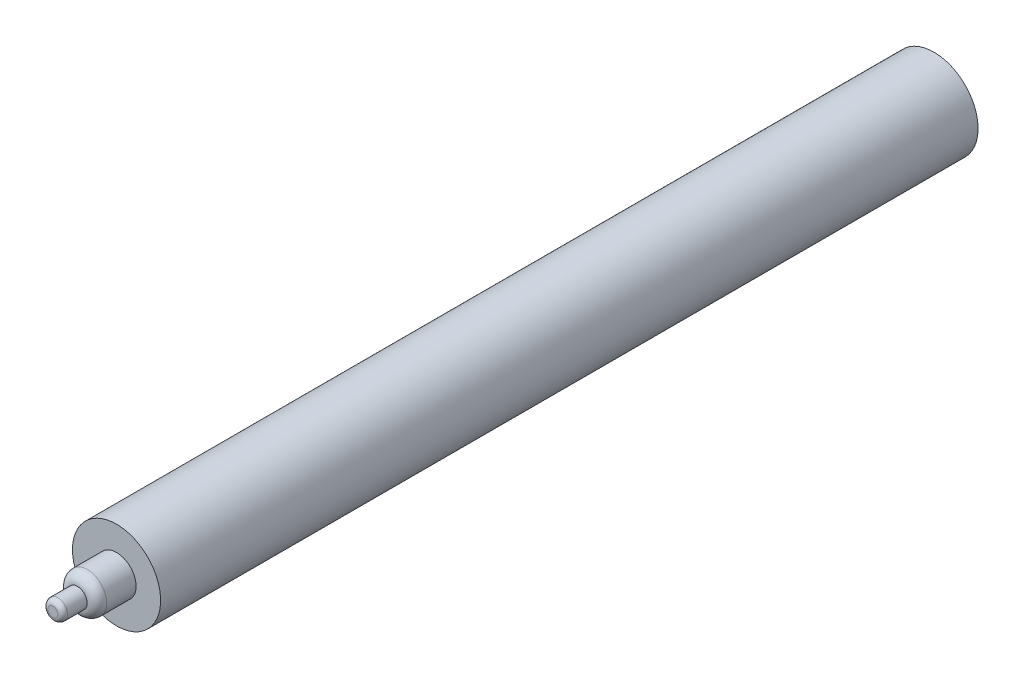
ISO-10303-21;
HEADER;
FILE_DESCRIPTION(('STEP AP214'),'2;1');
FILE_NAME('part.step','',(''),(''),'','','');
FILE_SCHEMA(('AUTOMOTIVE_DESIGN { 1 0 10303 214 1 1 1 1 }'));
ENDSEC;
DATA;
#1=APPLICATION_CONTEXT('core data for automotive mechanical design processes');
#2=APPLICATION_PROTOCOL_DEFINITION('international standard','automotive_design',2000,#1);
#3=PRODUCT_CONTEXT('',#1,'mechanical');
#4=PRODUCT('Part','Part','',(#3));
#5=PRODUCT_RELATED_PRODUCT_CATEGORY('part','',(#4));
#6=PRODUCT_DEFINITION_FORMATION('','',#4);
#7=PRODUCT_DEFINITION_CONTEXT('part definition',#1,'design');
#8=PRODUCT_DEFINITION('design','',#6,#7);
#9=PRODUCT_DEFINITION_SHAPE('','',#8);
#10=(LENGTH_UNIT() NAMED_UNIT(*) SI_UNIT(.MILLI.,.METRE.));
#11=(NAMED_UNIT(*) PLANE_ANGLE_UNIT() SI_UNIT($,.RADIAN.));
#12=(NAMED_UNIT(*) SI_UNIT($,.STERADIAN.) SOLID_ANGLE_UNIT());
#13=UNCERTAINTY_MEASURE_WITH_UNIT(LENGTH_MEASURE(1.E-05),#10,'distance_accuracy_value','');
#14=(GEOMETRIC_REPRESENTATION_CONTEXT(3) GLOBAL_UNCERTAINTY_ASSIGNED_CONTEXT((#13)) GLOBAL_UNIT_ASSIGNED_CONTEXT((#10,
#11,#12)) REPRESENTATION_CONTEXT('',''));
#15=CARTESIAN_POINT('',(0.,0.,0.));
#16=DIRECTION('',(0.,0.,1.));
#17=DIRECTION('',(1.,0.,0.));
#18=AXIS2_PLACEMENT_3D('',#15,#16,#17);
#19=CARTESIAN_POINT('',(0.,0.,167.));
#20=DIRECTION('',(0.,0.,-1.));
#21=DIRECTION('',(-1.,0.,0.));
#22=AXIS2_PLACEMENT_3D('',#19,#20,#21);
#23=CYLINDRICAL_SURFACE('',#22,9.);
#24=CARTESIAN_POINT('',(0.,0.,167.));
#25=DIRECTION('',(0.,0.,1.));
#26=DIRECTION('',(1.,0.,0.));
#27=AXIS2_PLACEMENT_3D('',#24,#25,#26);
#28=CIRCLE('',#27,9.);
#29=CARTESIAN_POINT('',(-9.,0.,167.));
#30=VERTEX_POINT('',#29);
#31=EDGE_CURVE('E58',#30,#30,#28,.T.);
#32=CARTESIAN_POINT('',(0.,0.,0.));
#33=DIRECTION('',(0.,0.,1.));
#34=DIRECTION('',(1.,0.,0.));
#35=AXIS2_PLACEMENT_3D('',#32,#33,#34);
#36=CIRCLE('',#35,9.);
#37=CARTESIAN_POINT('',(-9.,0.,0.));
#38=VERTEX_POINT('',#37);
#39=EDGE_CURVE('E55',#38,#38,#36,.T.);
#40=CARTESIAN_POINT('',(-9.,0.,167.));
#41=CARTESIAN_POINT('',(-9.,0.,165.260416666667));
#42=CARTESIAN_POINT('',(-9.,0.,163.520833333333));
#43=CARTESIAN_POINT('',(-9.,0.,160.041666666667));
#44=CARTESIAN_POINT('',(-9.,0.,158.302083333333));
#45=CARTESIAN_POINT('',(-9.,0.,154.822916666667));
#46=CARTESIAN_POINT('',(-9.,0.,153.083333333333));
#47=CARTESIAN_POINT('',(-9.,0.,149.604166666667));
#48=CARTESIAN_POINT('',(-9.,0.,147.864583333333));
#49=CARTESIAN_POINT('',(-9.,0.,144.385416666667));
#50=CARTESIAN_POINT('',(-9.,0.,142.645833333333));
#51=CARTESIAN_POINT('',(-9.,0.,139.166666666667));
#52=CARTESIAN_POINT('',(-9.,0.,137.427083333333));
#53=CARTESIAN_POINT('',(-9.,0.,133.947916666667));
#54=CARTESIAN_POINT('',(-9.,0.,132.208333333333));
#55=CARTESIAN_POINT('',(-9.,0.,128.729166666667));
#56=CARTESIAN_POINT('',(-9.,0.,126.989583333333));
#57=CARTESIAN_POINT('',(-9.,0.,123.510416666667));
#58=CARTESIAN_POINT('',(-9.,0.,121.770833333333));
#59=CARTESIAN_POINT('',(-9.,0.,118.291666666667));
#60=CARTESIAN_POINT('',(-9.,0.,116.552083333333));
#61=CARTESIAN_POINT('',(-9.,0.,113.072916666667));
#62=CARTESIAN_POINT('',(-9.,0.,111.333333333333));
#63=CARTESIAN_POINT('',(-9.,0.,107.854166666667));
#64=CARTESIAN_POINT('',(-9.,0.,106.114583333333));
#65=CARTESIAN_POINT('',(-9.,0.,102.635416666667));
#66=CARTESIAN_POINT('',(-9.,0.,100.895833333333));
#67=CARTESIAN_POINT('',(-9.,0.,97.4166666666667));
#68=CARTESIAN_POINT('',(-9.,0.,95.6770833333333));
#69=CARTESIAN_POINT('',(-9.,0.,92.1979166666667));
#70=CARTESIAN_POINT('',(-9.,0.,90.4583333333333));
#71=CARTESIAN_POINT('',(-9.,0.,86.9791666666667));
#72=CARTESIAN_POINT('',(-9.,0.,85.2395833333333));
#73=CARTESIAN_POINT('',(-9.,0.,81.7604166666667));
#74=CARTESIAN_POINT('',(-9.,0.,80.0208333333333));
#75=CARTESIAN_POINT('',(-9.,0.,76.5416666666667));
#76=CARTESIAN_POINT('',(-9.,0.,74.8020833333333));
#77=CARTESIAN_POINT('',(-9.,0.,71.3229166666667));
#78=CARTESIAN_POINT('',(-9.,0.,69.5833333333333));
#79=CARTESIAN_POINT('',(-9.,0.,66.1041666666667));
#80=CARTESIAN_POINT('',(-9.,0.,64.3645833333333));
#81=CARTESIAN_POINT('',(-9.,0.,60.8854166666667));
#82=CARTESIAN_POINT('',(-9.,0.,59.1458333333333));
#83=CARTESIAN_POINT('',(-9.,0.,55.6666666666667));
#84=CARTESIAN_POINT('',(-9.,0.,53.9270833333333));
#85=CARTESIAN_POINT('',(-9.,0.,50.4479166666667));
#86=CARTESIAN_POINT('',(-9.,0.,48.7083333333333));
#87=CARTESIAN_POINT('',(-9.,0.,45.2291666666667));
#88=CARTESIAN_POINT('',(-9.,0.,43.4895833333333));
#89=CARTESIAN_POINT('',(-9.,0.,40.0104166666667));
#90=CARTESIAN_POINT('',(-9.,0.,38.2708333333333));
#91=CARTESIAN_POINT('',(-9.,0.,34.7916666666667));
#92=CARTESIAN_POINT('',(-9.,0.,33.0520833333333));
#93=CARTESIAN_POINT('',(-9.,0.,29.5729166666667));
#94=CARTESIAN_POINT('',(-9.,0.,27.8333333333333));
#95=CARTESIAN_POINT('',(-9.,0.,24.3541666666667));
#96=CARTESIAN_POINT('',(-9.,0.,22.6145833333333));
#97=CARTESIAN_POINT('',(-9.,0.,19.1354166666667));
#98=CARTESIAN_POINT('',(-9.,0.,17.3958333333333));
#99=CARTESIAN_POINT('',(-9.,0.,13.9166666666667));
#100=CARTESIAN_POINT('',(-9.,0.,12.1770833333333));
#101=CARTESIAN_POINT('',(-9.,0.,8.69791666666666));
#102=CARTESIAN_POINT('',(-9.,0.,6.95833333333333));
#103=CARTESIAN_POINT('',(-9.,0.,3.47916666666666));
#104=CARTESIAN_POINT('',(-9.,0.,1.73958333333333));
#105=CARTESIAN_POINT('',(-9.,0.,0.));
#106=B_SPLINE_CURVE_WITH_KNOTS('',3,(#40,#41,#42,#43,#44,#45,#46,#47,#48,#49,#50,#51,#52,#53,
#54,#55,#56,#57,#58,#59,#60,#61,#62,#63,#64,#65,#66,#67,#68,#69,#70,#71,#72,#73,#74,#75,#76,#77,
#78,#79,#80,#81,#82,#83,#84,#85,#86,#87,#88,#89,#90,#91,#92,#93,#94,#95,#96,#97,#98,#99,#100,
#101,#102,#103,#104,#105),.UNSPECIFIED.,.F.,.F.,(4,2,2,2,2,2,2,2,2,2,2,2,2,2,2,2,2,2,2,2,2,2,2,
2,2,2,2,2,2,2,2,2,4),(0.,5.21874999999999,10.4375,15.65625,20.875,26.09375,31.3125,36.53125,
41.75,46.96875,52.1875,57.40625,62.625,67.84375,73.0625,78.28125,83.5,88.71875,93.9375,99.15625,
104.375,109.59375,114.8125,120.03125,125.25,130.46875,135.6875,140.90625,146.125,151.34375,
156.5625,161.78125,167.),.UNSPECIFIED.);
#107=EDGE_CURVE('BSEAM37',#30,#38,#106,.T.);
#108=ORIENTED_EDGE('',*,*,#31,.F.);
#109=ORIENTED_EDGE('',*,*,#39,.T.);
#110=ORIENTED_EDGE('',*,*,#107,.T.);
#111=ORIENTED_EDGE('',*,*,#107,.F.);
#112=EDGE_LOOP('',(#108,#110,#109,#111));
#113=FACE_BOUND('',#112,.T.);
#114=ADVANCED_FACE('F37',(#113),#23,.T.);
#115=CARTESIAN_POINT('',(0.,0.,167.));
#116=DIRECTION('',(0.,0.,1.));
#117=DIRECTION('',(1.,0.,0.));
#118=AXIS2_PLACEMENT_3D('',#115,#116,#117);
#119=PLANE('',#118);
#120=CARTESIAN_POINT('',(0.,0.,167.));
#121=DIRECTION('',(0.,0.,1.));
#122=DIRECTION('',(1.,0.,0.));
#123=AXIS2_PLACEMENT_3D('',#120,#121,#122);
#124=CIRCLE('',#123,4.);
#125=CARTESIAN_POINT('',(4.,0.,167.));
#126=VERTEX_POINT('',#125);
#127=EDGE_CURVE('E61',#126,#126,#124,.T.);
#128=ORIENTED_EDGE('',*,*,#127,.F.);
#129=EDGE_LOOP('',(#128));
#130=FACE_BOUND('',#129,.T.);
#131=ORIENTED_EDGE('',*,*,#31,.T.);
#132=EDGE_LOOP('',(#131));
#133=FACE_BOUND('',#132,.T.);
#134=ADVANCED_FACE('F82',(#130,#133),#119,.T.);
#135=CARTESIAN_POINT('',(0.,0.,0.));
#136=DIRECTION('',(0.,0.,1.));
#137=DIRECTION('',(1.,0.,0.));
#138=AXIS2_PLACEMENT_3D('',#135,#136,#137);
#139=PLANE('',#138);
#140=ORIENTED_EDGE('',*,*,#39,.F.);
#141=EDGE_LOOP('',(#140));
#142=FACE_BOUND('',#141,.T.);
#143=ADVANCED_FACE('F87',(#142),#139,.F.);
#144=CARTESIAN_POINT('',(0.,0.,175.));
#145=DIRECTION('',(0.,0.,-1.));
#146=DIRECTION('',(-1.,0.,0.));
#147=AXIS2_PLACEMENT_3D('',#144,#145,#146);
#148=CYLINDRICAL_SURFACE('',#147,4.);
#149=CARTESIAN_POINT('',(0.,0.,173.));
#150=DIRECTION('',(0.,0.,1.));
#151=DIRECTION('',(1.,0.,0.));
#152=AXIS2_PLACEMENT_3D('',#149,#150,#151);
#153=CIRCLE('',#152,4.);
#154=CARTESIAN_POINT('',(4.,0.,173.));
#155=VERTEX_POINT('',#154);
#156=EDGE_CURVE('E48',#155,#155,#153,.F.);
#157=ORIENTED_EDGE('',*,*,#156,.T.);
#158=EDGE_LOOP('',(#157));
#159=FACE_BOUND('',#158,.T.);
#160=ORIENTED_EDGE('',*,*,#127,.T.);
#161=EDGE_LOOP('',(#160));
#162=FACE_BOUND('',#161,.T.);
#163=ADVANCED_FACE('F94',(#159,#162),#148,.T.);
#164=CARTESIAN_POINT('',(0.,0.,180.));
#165=DIRECTION('',(0.,0.,-1.));
#166=DIRECTION('',(-1.,0.,0.));
#167=AXIS2_PLACEMENT_3D('',#164,#165,#166);
#168=CYLINDRICAL_SURFACE('',#167,2.);
#169=CARTESIAN_POINT('',(0.,0.,179.));
#170=DIRECTION('',(0.,0.,1.));
#171=DIRECTION('',(1.,0.,0.));
#172=AXIS2_PLACEMENT_3D('',#169,#170,#171);
#173=CIRCLE('',#172,2.);
#174=CARTESIAN_POINT('',(2.,0.,179.));
#175=VERTEX_POINT('',#174);
#176=EDGE_CURVE('E10',#175,#175,#173,.F.);
#177=ORIENTED_EDGE('',*,*,#176,.T.);
#178=EDGE_LOOP('',(#177));
#179=FACE_BOUND('',#178,.T.);
#180=CARTESIAN_POINT('',(0.,0.,175.));
#181=DIRECTION('',(0.,0.,1.));
#182=DIRECTION('',(1.,0.,0.));
#183=AXIS2_PLACEMENT_3D('',#180,#181,#182);
#184=CIRCLE('',#183,2.);
#185=CARTESIAN_POINT('',(2.,0.,175.));
#186=VERTEX_POINT('',#185);
#187=EDGE_CURVE('E52',#186,#186,#184,.T.);
#188=ORIENTED_EDGE('',*,*,#187,.T.);
#189=EDGE_LOOP('',(#188));
#190=FACE_BOUND('',#189,.T.);
#191=ADVANCED_FACE('F67',(#179,#190),#168,.T.);
#192=CARTESIAN_POINT('',(0.,0.,180.));
#193=DIRECTION('',(0.,0.,1.));
#194=DIRECTION('',(1.,0.,0.));
#195=AXIS2_PLACEMENT_3D('',#192,#193,#194);
#196=PLANE('',#195);
#197=CARTESIAN_POINT('',(0.,0.,180.));
#198=DIRECTION('',(0.,0.,1.));
#199=DIRECTION('',(1.,0.,0.));
#200=AXIS2_PLACEMENT_3D('',#197,#198,#199);
#201=CIRCLE('',#200,1.);
#202=CARTESIAN_POINT('',(1.,0.,180.));
#203=VERTEX_POINT('',#202);
#204=EDGE_CURVE('E44',#203,#203,#201,.T.);
#205=ORIENTED_EDGE('',*,*,#204,.T.);
#206=EDGE_LOOP('',(#205));
#207=FACE_BOUND('',#206,.T.);
#208=ADVANCED_FACE('F71',(#207),#196,.T.);
#209=CARTESIAN_POINT('',(0.,0.,173.));
#210=DIRECTION('',(0.,0.,1.));
#211=DIRECTION('',(1.,0.,0.));
#212=AXIS2_PLACEMENT_3D('',#209,#210,#211);
#213=DEGENERATE_TOROIDAL_SURFACE('',#212,2.,2.,.T.);
#214=ORIENTED_EDGE('',*,*,#156,.F.);
#215=EDGE_LOOP('',(#214));
#216=FACE_BOUND('',#215,.T.);
#217=ORIENTED_EDGE('',*,*,#187,.F.);
#218=EDGE_LOOP('',(#217));
#219=FACE_BOUND('',#218,.T.);
#220=ADVANCED_FACE('F69',(#216,#219),#213,.T.);
#221=CARTESIAN_POINT('',(0.,0.,179.));
#222=DIRECTION('',(0.,0.,1.));
#223=DIRECTION('',(1.,0.,0.));
#224=AXIS2_PLACEMENT_3D('',#221,#222,#223);
#225=DEGENERATE_TOROIDAL_SURFACE('',#224,1.,1.,.T.);
#226=ORIENTED_EDGE('',*,*,#176,.F.);
#227=EDGE_LOOP('',(#226));
#228=FACE_BOUND('',#227,.T.);
#229=ORIENTED_EDGE('',*,*,#204,.F.);
#230=EDGE_LOOP('',(#229));
#231=FACE_BOUND('',#230,.T.);
#232=ADVANCED_FACE('F39',(#228,#231),#225,.T.);
#233=CLOSED_SHELL('',(#114,#134,#143,#163,#191,#208,#220,#232));
#234=MANIFOLD_SOLID_BREP('B2',#233);
#235=ADVANCED_BREP_SHAPE_REPRESENTATION('',(#18,#234),#14);
#236=SHAPE_DEFINITION_REPRESENTATION(#9,#235);
ENDSEC;
END-ISO-10303-21;
